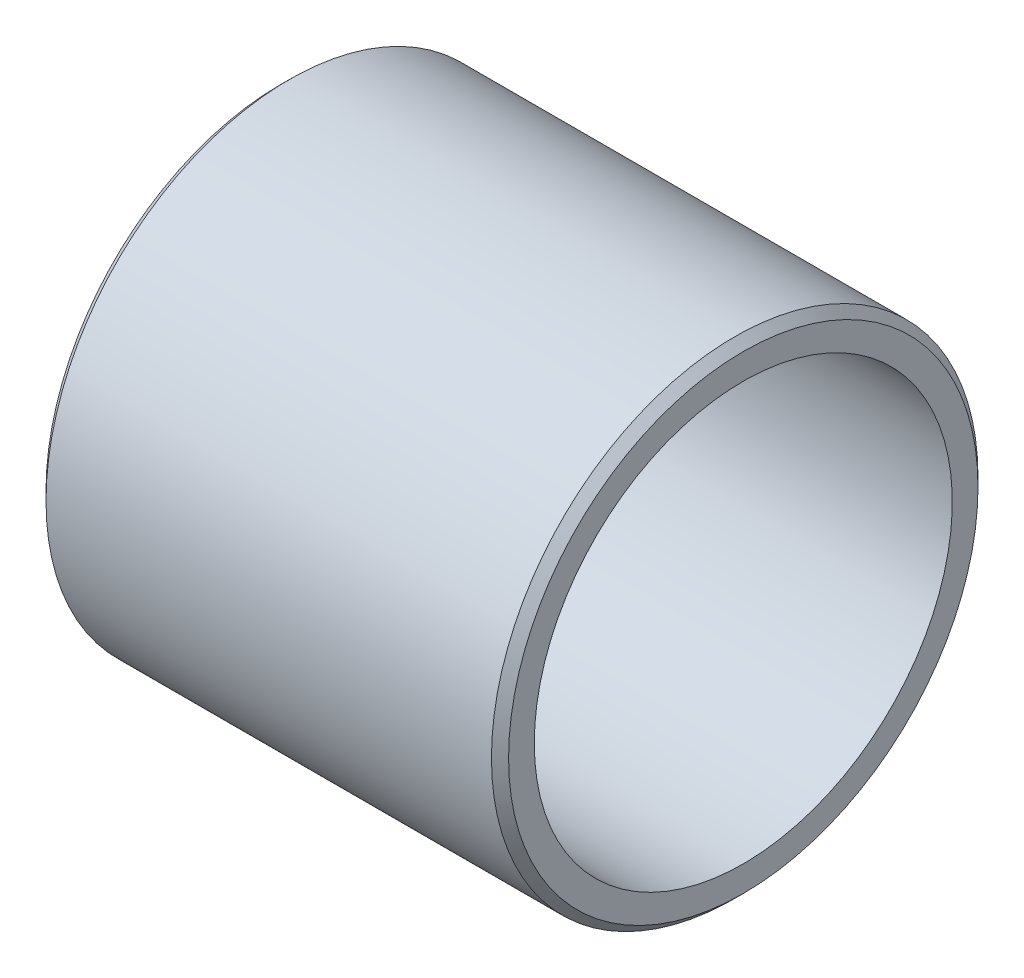
ISO-10303-21;
HEADER;
FILE_DESCRIPTION(('STEP AP214'),'2;1');
FILE_NAME('part.step','',(''),(''),'','','');
FILE_SCHEMA(('AUTOMOTIVE_DESIGN { 1 0 10303 214 1 1 1 1 }'));
ENDSEC;
DATA;
#1=APPLICATION_CONTEXT('core data for automotive mechanical design processes');
#2=APPLICATION_PROTOCOL_DEFINITION('international standard','automotive_design',2000,#1);
#3=PRODUCT_CONTEXT('',#1,'mechanical');
#4=PRODUCT('Part','Part','',(#3));
#5=PRODUCT_RELATED_PRODUCT_CATEGORY('part','',(#4));
#6=PRODUCT_DEFINITION_FORMATION('','',#4);
#7=PRODUCT_DEFINITION_CONTEXT('part definition',#1,'design');
#8=PRODUCT_DEFINITION('design','',#6,#7);
#9=PRODUCT_DEFINITION_SHAPE('','',#8);
#10=(LENGTH_UNIT() NAMED_UNIT(*) SI_UNIT(.MILLI.,.METRE.));
#11=(NAMED_UNIT(*) PLANE_ANGLE_UNIT() SI_UNIT($,.RADIAN.));
#12=(NAMED_UNIT(*) SI_UNIT($,.STERADIAN.) SOLID_ANGLE_UNIT());
#13=UNCERTAINTY_MEASURE_WITH_UNIT(LENGTH_MEASURE(1.E-05),#10,'distance_accuracy_value','');
#14=(GEOMETRIC_REPRESENTATION_CONTEXT(3) GLOBAL_UNCERTAINTY_ASSIGNED_CONTEXT((#13)) GLOBAL_UNIT_ASSIGNED_CONTEXT((#10,
#11,#12)) REPRESENTATION_CONTEXT('',''));
#15=CARTESIAN_POINT('',(0.,0.,0.));
#16=DIRECTION('',(0.,0.,1.));
#17=DIRECTION('',(1.,0.,0.));
#18=AXIS2_PLACEMENT_3D('',#15,#16,#17);
#19=CARTESIAN_POINT('',(0.,0.,0.));
#20=DIRECTION('',(-1.,0.,0.));
#21=DIRECTION('',(0.,0.,1.));
#22=AXIS2_PLACEMENT_3D('',#19,#20,#21);
#23=CYLINDRICAL_SURFACE('',#22,12.2);
#24=CARTESIAN_POINT('',(13.5,0.,0.));
#25=DIRECTION('',(-1.,0.,0.));
#26=DIRECTION('',(0.,0.,1.));
#27=AXIS2_PLACEMENT_3D('',#24,#25,#26);
#28=CIRCLE('',#27,12.2);
#29=CARTESIAN_POINT('',(13.5,0.,12.2));
#30=VERTEX_POINT('',#29);
#31=EDGE_CURVE('E53',#30,#30,#28,.T.);
#32=ORIENTED_EDGE('',*,*,#31,.F.);
#33=EDGE_LOOP('',(#32));
#34=FACE_BOUND('',#33,.T.);
#35=CARTESIAN_POINT('',(-13.5,0.,0.));
#36=DIRECTION('',(-1.,0.,0.));
#37=DIRECTION('',(0.,0.,1.));
#38=AXIS2_PLACEMENT_3D('',#35,#36,#37);
#39=CIRCLE('',#38,12.2);
#40=CARTESIAN_POINT('',(-13.5,0.,12.2));
#41=VERTEX_POINT('',#40);
#42=EDGE_CURVE('E50',#41,#41,#39,.T.);
#43=ORIENTED_EDGE('',*,*,#42,.T.);
#44=EDGE_LOOP('',(#43));
#45=FACE_BOUND('',#44,.T.);
#46=ADVANCED_FACE('F31',(#34,#45),#23,.F.);
#47=CARTESIAN_POINT('',(-13.5,12.2,0.));
#48=DIRECTION('',(-1.,0.,0.));
#49=DIRECTION('',(0.,0.,1.));
#50=AXIS2_PLACEMENT_3D('',#47,#48,#49);
#51=PLANE('',#50);
#52=CARTESIAN_POINT('',(-13.5,0.,0.));
#53=DIRECTION('',(-1.,0.,0.));
#54=DIRECTION('',(0.,0.,1.));
#55=AXIS2_PLACEMENT_3D('',#52,#53,#54);
#56=CIRCLE('',#55,13.7);
#57=CARTESIAN_POINT('',(-13.5,0.,13.7));
#58=VERTEX_POINT('',#57);
#59=EDGE_CURVE('E45',#58,#58,#56,.T.);
#60=ORIENTED_EDGE('',*,*,#59,.T.);
#61=EDGE_LOOP('',(#60));
#62=FACE_BOUND('',#61,.T.);
#63=ORIENTED_EDGE('',*,*,#42,.F.);
#64=EDGE_LOOP('',(#63));
#65=FACE_BOUND('',#64,.T.);
#66=ADVANCED_FACE('F61',(#62,#65),#51,.T.);
#67=CARTESIAN_POINT('',(0.,0.,0.));
#68=DIRECTION('',(-1.,0.,0.));
#69=DIRECTION('',(0.,0.,1.));
#70=AXIS2_PLACEMENT_3D('',#67,#68,#69);
#71=CYLINDRICAL_SURFACE('',#70,14.2);
#72=CARTESIAN_POINT('',(-13.,0.,0.));
#73=DIRECTION('',(-1.,0.,0.));
#74=DIRECTION('',(0.,0.,1.));
#75=AXIS2_PLACEMENT_3D('',#72,#73,#74);
#76=CIRCLE('',#75,14.2);
#77=CARTESIAN_POINT('',(-13.,0.,14.2));
#78=VERTEX_POINT('',#77);
#79=EDGE_CURVE('E37',#78,#78,#76,.F.);
#80=ORIENTED_EDGE('',*,*,#79,.T.);
#81=EDGE_LOOP('',(#80));
#82=FACE_BOUND('',#81,.T.);
#83=CARTESIAN_POINT('',(13.,0.,0.));
#84=DIRECTION('',(1.,0.,0.));
#85=DIRECTION('',(0.,0.,-1.));
#86=AXIS2_PLACEMENT_3D('',#83,#84,#85);
#87=CIRCLE('',#86,14.2);
#88=CARTESIAN_POINT('',(13.,0.,-14.2));
#89=VERTEX_POINT('',#88);
#90=EDGE_CURVE('E41',#89,#89,#87,.F.);
#91=ORIENTED_EDGE('',*,*,#90,.T.);
#92=EDGE_LOOP('',(#91));
#93=FACE_BOUND('',#92,.T.);
#94=ADVANCED_FACE('F65',(#82,#93),#71,.T.);
#95=CARTESIAN_POINT('',(13.5,14.2,0.));
#96=DIRECTION('',(1.,0.,0.));
#97=DIRECTION('',(0.,0.,-1.));
#98=AXIS2_PLACEMENT_3D('',#95,#96,#97);
#99=PLANE('',#98);
#100=CARTESIAN_POINT('',(13.5,0.,0.));
#101=DIRECTION('',(1.,0.,0.));
#102=DIRECTION('',(0.,0.,-1.));
#103=AXIS2_PLACEMENT_3D('',#100,#101,#102);
#104=CIRCLE('',#103,13.7);
#105=CARTESIAN_POINT('',(13.5,0.,-13.7));
#106=VERTEX_POINT('',#105);
#107=EDGE_CURVE('E10',#106,#106,#104,.T.);
#108=ORIENTED_EDGE('',*,*,#107,.T.);
#109=EDGE_LOOP('',(#108));
#110=FACE_BOUND('',#109,.T.);
#111=ORIENTED_EDGE('',*,*,#31,.T.);
#112=EDGE_LOOP('',(#111));
#113=FACE_BOUND('',#112,.T.);
#114=ADVANCED_FACE('F57',(#110,#113),#99,.T.);
#115=CARTESIAN_POINT('',(-13.5,0.,0.));
#116=DIRECTION('',(1.,0.,0.));
#117=DIRECTION('',(0.,0.,-1.));
#118=AXIS2_PLACEMENT_3D('',#115,#116,#117);
#119=CONICAL_SURFACE('',#118,13.7,0.785398163397453);
#120=ORIENTED_EDGE('',*,*,#79,.F.);
#121=EDGE_LOOP('',(#120));
#122=FACE_BOUND('',#121,.T.);
#123=ORIENTED_EDGE('',*,*,#59,.F.);
#124=EDGE_LOOP('',(#123));
#125=FACE_BOUND('',#124,.T.);
#126=ADVANCED_FACE('F74',(#122,#125),#119,.T.);
#127=CARTESIAN_POINT('',(13.,0.,0.));
#128=DIRECTION('',(-1.,0.,0.));
#129=DIRECTION('',(0.,0.,1.));
#130=AXIS2_PLACEMENT_3D('',#127,#128,#129);
#131=CONICAL_SURFACE('',#130,14.2,0.785398163397443);
#132=ORIENTED_EDGE('',*,*,#107,.F.);
#133=EDGE_LOOP('',(#132));
#134=FACE_BOUND('',#133,.T.);
#135=ORIENTED_EDGE('',*,*,#90,.F.);
#136=EDGE_LOOP('',(#135));
#137=FACE_BOUND('',#136,.T.);
#138=ADVANCED_FACE('F77',(#134,#137),#131,.T.);
#139=CLOSED_SHELL('',(#46,#66,#94,#114,#126,#138));
#140=MANIFOLD_SOLID_BREP('B2',#139);
#141=ADVANCED_BREP_SHAPE_REPRESENTATION('',(#18,#140),#14);
#142=SHAPE_DEFINITION_REPRESENTATION(#9,#141);
ENDSEC;
END-ISO-10303-21;
